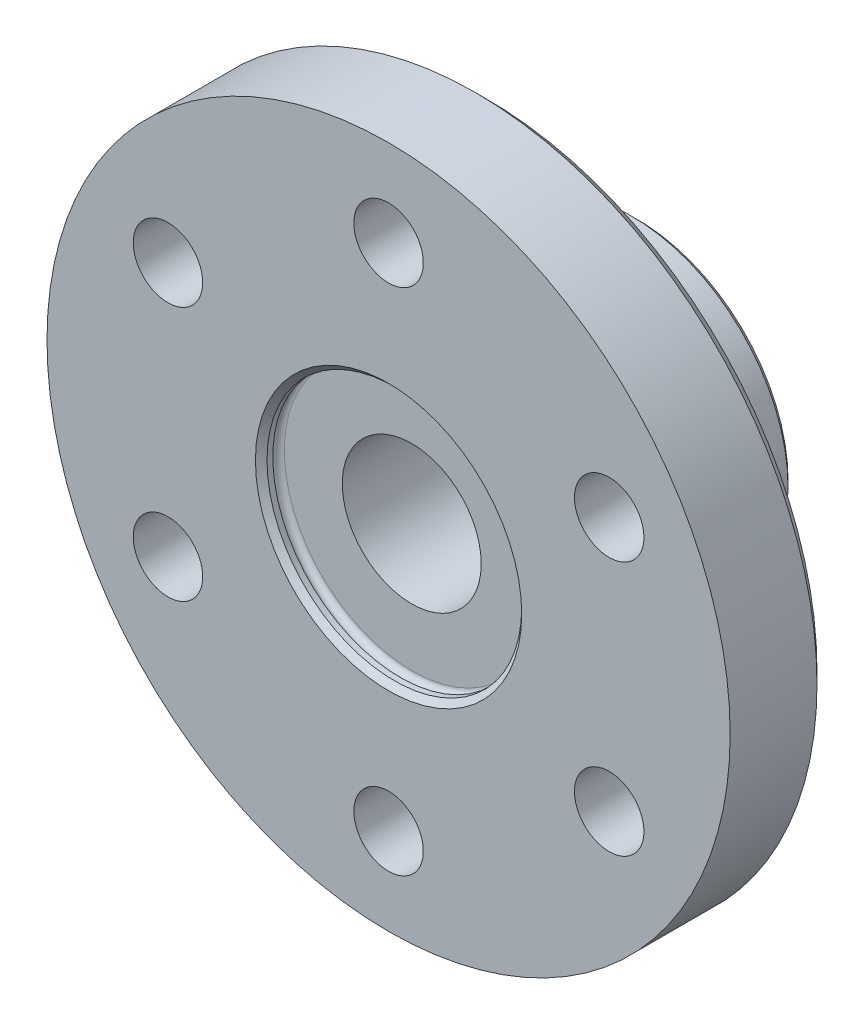
ISO-10303-21;
HEADER;
FILE_DESCRIPTION(('STEP AP214'),'2;1');
FILE_NAME('part.step','',(''),(''),'','','');
FILE_SCHEMA(('AUTOMOTIVE_DESIGN { 1 0 10303 214 1 1 1 1 }'));
ENDSEC;
DATA;
#1=APPLICATION_CONTEXT('core data for automotive mechanical design processes');
#2=APPLICATION_PROTOCOL_DEFINITION('international standard','automotive_design',2000,#1);
#3=PRODUCT_CONTEXT('',#1,'mechanical');
#4=PRODUCT('Part','Part','',(#3));
#5=PRODUCT_RELATED_PRODUCT_CATEGORY('part','',(#4));
#6=PRODUCT_DEFINITION_FORMATION('','',#4);
#7=PRODUCT_DEFINITION_CONTEXT('part definition',#1,'design');
#8=PRODUCT_DEFINITION('design','',#6,#7);
#9=PRODUCT_DEFINITION_SHAPE('','',#8);
#10=(LENGTH_UNIT() NAMED_UNIT(*) SI_UNIT(.MILLI.,.METRE.));
#11=(NAMED_UNIT(*) PLANE_ANGLE_UNIT() SI_UNIT($,.RADIAN.));
#12=(NAMED_UNIT(*) SI_UNIT($,.STERADIAN.) SOLID_ANGLE_UNIT());
#13=UNCERTAINTY_MEASURE_WITH_UNIT(LENGTH_MEASURE(1.E-05),#10,'distance_accuracy_value','');
#14=(GEOMETRIC_REPRESENTATION_CONTEXT(3) GLOBAL_UNCERTAINTY_ASSIGNED_CONTEXT((#13)) GLOBAL_UNIT_ASSIGNED_CONTEXT((#10,
#11,#12)) REPRESENTATION_CONTEXT('',''));
#15=CARTESIAN_POINT('',(0.,0.,0.));
#16=DIRECTION('',(0.,0.,1.));
#17=DIRECTION('',(1.,0.,0.));
#18=AXIS2_PLACEMENT_3D('',#15,#16,#17);
#19=CARTESIAN_POINT('',(0.,0.,-0.376389422192273));
#20=DIRECTION('',(0.,0.,1.));
#21=DIRECTION('',(1.,0.,0.));
#22=AXIS2_PLACEMENT_3D('',#19,#20,#21);
#23=TOROIDAL_SURFACE('',#22,22.,1.);
#24=CARTESIAN_POINT('',(0.,0.,-1.37638942219227));
#25=DIRECTION('',(0.,0.,1.));
#26=DIRECTION('',(1.,0.,0.));
#27=AXIS2_PLACEMENT_3D('',#24,#25,#26);
#28=CIRCLE('',#27,22.);
#29=CARTESIAN_POINT('',(22.,0.,-1.37638942219227));
#30=VERTEX_POINT('',#29);
#31=EDGE_CURVE('E78',#30,#30,#28,.T.);
#32=ORIENTED_EDGE('',*,*,#31,.F.);
#33=EDGE_LOOP('',(#32));
#34=FACE_BOUND('',#33,.T.);
#35=CARTESIAN_POINT('',(0.,0.,0.623610577807727));
#36=DIRECTION('',(0.,0.,1.));
#37=DIRECTION('',(1.,0.,0.));
#38=AXIS2_PLACEMENT_3D('',#35,#36,#37);
#39=CIRCLE('',#38,22.);
#40=CARTESIAN_POINT('',(22.,0.,0.623610577807727));
#41=VERTEX_POINT('',#40);
#42=EDGE_CURVE('E87',#41,#41,#39,.T.);
#43=ORIENTED_EDGE('',*,*,#42,.T.);
#44=EDGE_LOOP('',(#43));
#45=FACE_BOUND('',#44,.T.);
#46=ADVANCED_FACE('F39',(#34,#45),#23,.F.);
#47=CARTESIAN_POINT('',(0.,12.,-1.37638942219227));
#48=DIRECTION('',(0.,0.,-1.));
#49=DIRECTION('',(-1.,0.,0.));
#50=AXIS2_PLACEMENT_3D('',#47,#48,#49);
#51=PLANE('',#50);
#52=CARTESIAN_POINT('',(0.,0.,-1.37638942219227));
#53=DIRECTION('',(0.,0.,1.));
#54=DIRECTION('',(1.,0.,0.));
#55=AXIS2_PLACEMENT_3D('',#52,#53,#54);
#56=CIRCLE('',#55,12.);
#57=CARTESIAN_POINT('',(12.,0.,-1.37638942219227));
#58=VERTEX_POINT('',#57);
#59=EDGE_CURVE('E81',#58,#58,#56,.T.);
#60=ORIENTED_EDGE('',*,*,#59,.F.);
#61=EDGE_LOOP('',(#60));
#62=FACE_BOUND('',#61,.T.);
#63=ORIENTED_EDGE('',*,*,#31,.T.);
#64=EDGE_LOOP('',(#63));
#65=FACE_BOUND('',#64,.T.);
#66=ADVANCED_FACE('F160',(#62,#65),#51,.F.);
#67=CARTESIAN_POINT('',(0.,0.,9.0012233726392));
#68=DIRECTION('',(0.,0.,1.));
#69=DIRECTION('',(1.,0.,0.));
#70=AXIS2_PLACEMENT_3D('',#67,#68,#69);
#71=CYLINDRICAL_SURFACE('',#70,12.);
#72=CARTESIAN_POINT('',(0.,0.,-39.3763894221923));
#73=DIRECTION('',(0.,0.,1.));
#74=DIRECTION('',(1.,0.,0.));
#75=AXIS2_PLACEMENT_3D('',#72,#73,#74);
#76=CIRCLE('',#75,12.);
#77=CARTESIAN_POINT('',(12.,0.,-39.3763894221923));
#78=VERTEX_POINT('',#77);
#79=EDGE_CURVE('E55',#78,#78,#76,.F.);
#80=ORIENTED_EDGE('',*,*,#79,.T.);
#81=EDGE_LOOP('',(#80));
#82=FACE_BOUND('',#81,.T.);
#83=ORIENTED_EDGE('',*,*,#59,.T.);
#84=EDGE_LOOP('',(#83));
#85=FACE_BOUND('',#84,.T.);
#86=ADVANCED_FACE('F166',(#82,#85),#71,.F.);
#87=CARTESIAN_POINT('',(0.,27.,-40.3763894221923));
#88=DIRECTION('',(0.,0.,1.));
#89=DIRECTION('',(1.,0.,0.));
#90=AXIS2_PLACEMENT_3D('',#87,#88,#89);
#91=PLANE('',#90);
#92=CARTESIAN_POINT('',(0.,0.,-40.3763894221923));
#93=DIRECTION('',(0.,0.,1.));
#94=DIRECTION('',(1.,0.,0.));
#95=AXIS2_PLACEMENT_3D('',#92,#93,#94);
#96=CIRCLE('',#95,13.);
#97=CARTESIAN_POINT('',(13.,0.,-40.3763894221923));
#98=VERTEX_POINT('',#97);
#99=EDGE_CURVE('E60',#98,#98,#96,.T.);
#100=ORIENTED_EDGE('',*,*,#99,.T.);
#101=EDGE_LOOP('',(#100));
#102=FACE_BOUND('',#101,.T.);
#103=CARTESIAN_POINT('',(0.,0.,-40.3763894221923));
#104=DIRECTION('',(0.,0.,1.));
#105=DIRECTION('',(1.,0.,0.));
#106=AXIS2_PLACEMENT_3D('',#103,#104,#105);
#107=CIRCLE('',#106,26.);
#108=CARTESIAN_POINT('',(26.,0.,-40.3763894221923));
#109=VERTEX_POINT('',#108);
#110=EDGE_CURVE('E63',#109,#109,#107,.F.);
#111=ORIENTED_EDGE('',*,*,#110,.T.);
#112=EDGE_LOOP('',(#111));
#113=FACE_BOUND('',#112,.T.);
#114=ADVANCED_FACE('F207',(#102,#113),#91,.F.);
#115=CARTESIAN_POINT('',(0.,0.,9.0012233726392));
#116=DIRECTION('',(0.,0.,1.));
#117=DIRECTION('',(1.,0.,0.));
#118=AXIS2_PLACEMENT_3D('',#115,#116,#117);
#119=CYLINDRICAL_SURFACE('',#118,27.);
#120=CARTESIAN_POINT('',(0.,0.,-39.3763894221923));
#121=DIRECTION('',(0.,0.,1.));
#122=DIRECTION('',(1.,0.,0.));
#123=AXIS2_PLACEMENT_3D('',#120,#121,#122);
#124=CIRCLE('',#123,27.);
#125=CARTESIAN_POINT('',(27.,0.,-39.3763894221923));
#126=VERTEX_POINT('',#125);
#127=EDGE_CURVE('E51',#126,#126,#124,.T.);
#128=ORIENTED_EDGE('',*,*,#127,.T.);
#129=EDGE_LOOP('',(#128));
#130=FACE_BOUND('',#129,.T.);
#131=CARTESIAN_POINT('',(0.,0.,-16.3763894221923));
#132=DIRECTION('',(0.,0.,1.));
#133=DIRECTION('',(1.,0.,0.));
#134=AXIS2_PLACEMENT_3D('',#131,#132,#133);
#135=CIRCLE('',#134,27.);
#136=CARTESIAN_POINT('',(27.,0.,-16.3763894221923));
#137=VERTEX_POINT('',#136);
#138=EDGE_CURVE('E72',#137,#137,#135,.F.);
#139=ORIENTED_EDGE('',*,*,#138,.T.);
#140=EDGE_LOOP('',(#139));
#141=FACE_BOUND('',#140,.T.);
#142=ADVANCED_FACE('F134',(#130,#141),#119,.T.);
#143=CARTESIAN_POINT('',(0.,59.,-14.3763894221923));
#144=DIRECTION('',(0.,0.,1.));
#145=DIRECTION('',(1.,0.,0.));
#146=AXIS2_PLACEMENT_3D('',#143,#144,#145);
#147=PLANE('',#146);
#148=CARTESIAN_POINT('',(0.,0.,-14.3763894221923));
#149=DIRECTION('',(0.,0.,1.));
#150=DIRECTION('',(1.,0.,0.));
#151=AXIS2_PLACEMENT_3D('',#148,#149,#150);
#152=CIRCLE('',#151,57.);
#153=CARTESIAN_POINT('',(57.,0.,-14.3763894221923));
#154=VERTEX_POINT('',#153);
#155=EDGE_CURVE('E10',#154,#154,#152,.F.);
#156=ORIENTED_EDGE('',*,*,#155,.T.);
#157=EDGE_LOOP('',(#156));
#158=FACE_BOUND('',#157,.T.);
#159=CARTESIAN_POINT('',(0.,0.,-14.3763894221923));
#160=DIRECTION('',(0.,0.,1.));
#161=DIRECTION('',(1.,0.,0.));
#162=AXIS2_PLACEMENT_3D('',#159,#160,#161);
#163=CIRCLE('',#162,29.);
#164=CARTESIAN_POINT('',(29.,0.,-14.3763894221923));
#165=VERTEX_POINT('',#164);
#166=EDGE_CURVE('E75',#165,#165,#163,.T.);
#167=ORIENTED_EDGE('',*,*,#166,.T.);
#168=EDGE_LOOP('',(#167));
#169=FACE_BOUND('',#168,.T.);
#170=CARTESIAN_POINT('',(38.105117766515,22.0000000000004,-14.3763894221923));
#171=DIRECTION('',(0.,0.,-1.));
#172=DIRECTION('',(-0.50000000000001,0.866025403784433,0.));
#173=AXIS2_PLACEMENT_3D('',#170,#171,#172);
#174=CIRCLE('',#173,6.);
#175=CARTESIAN_POINT('',(35.105117766515,27.196152422707,-14.3763894221923));
#176=VERTEX_POINT('',#175);
#177=EDGE_CURVE('E107',#176,#176,#174,.T.);
#178=ORIENTED_EDGE('',*,*,#177,.F.);
#179=EDGE_LOOP('',(#178));
#180=FACE_BOUND('',#179,.T.);
#181=CARTESIAN_POINT('',(38.1051177665155,-21.9999999999996,-14.3763894221923));
#182=DIRECTION('',(0.,0.,-1.));
#183=DIRECTION('',(0.499999999999992,0.866025403784443,0.));
#184=AXIS2_PLACEMENT_3D('',#181,#182,#183);
#185=CIRCLE('',#184,6.);
#186=CARTESIAN_POINT('',(41.1051177665154,-16.803847577293,-14.3763894221923));
#187=VERTEX_POINT('',#186);
#188=EDGE_CURVE('E106',#187,#187,#185,.T.);
#189=ORIENTED_EDGE('',*,*,#188,.F.);
#190=EDGE_LOOP('',(#189));
#191=FACE_BOUND('',#190,.T.);
#192=CARTESIAN_POINT('',(0.,-44.,-14.3763894221923));
#193=DIRECTION('',(0.,0.,-1.));
#194=DIRECTION('',(1.,0.,0.));
#195=AXIS2_PLACEMENT_3D('',#192,#193,#194);
#196=CIRCLE('',#195,6.);
#197=CARTESIAN_POINT('',(6.,-44.,-14.3763894221923));
#198=VERTEX_POINT('',#197);
#199=EDGE_CURVE('E113',#198,#198,#196,.T.);
#200=ORIENTED_EDGE('',*,*,#199,.F.);
#201=EDGE_LOOP('',(#200));
#202=FACE_BOUND('',#201,.T.);
#203=CARTESIAN_POINT('',(-38.1051177665152,-22.0000000000002,-14.3763894221923));
#204=DIRECTION('',(0.,0.,-1.));
#205=DIRECTION('',(0.500000000000004,-0.866025403784436,0.));
#206=AXIS2_PLACEMENT_3D('',#203,#204,#205);
#207=CIRCLE('',#206,6.);
#208=CARTESIAN_POINT('',(-35.1051177665152,-27.1961524227068,-14.3763894221923));
#209=VERTEX_POINT('',#208);
#210=EDGE_CURVE('E119',#209,#209,#207,.T.);
#211=ORIENTED_EDGE('',*,*,#210,.F.);
#212=EDGE_LOOP('',(#211));
#213=FACE_BOUND('',#212,.T.);
#214=CARTESIAN_POINT('',(-38.1051177665153,21.9999999999999,-14.3763894221923));
#215=DIRECTION('',(0.,0.,-1.));
#216=DIRECTION('',(-0.499999999999998,-0.86602540378444,0.));
#217=AXIS2_PLACEMENT_3D('',#214,#215,#216);
#218=CIRCLE('',#217,6.);
#219=CARTESIAN_POINT('',(-41.1051177665153,16.8038475772933,-14.3763894221923));
#220=VERTEX_POINT('',#219);
#221=EDGE_CURVE('E99',#220,#220,#218,.T.);
#222=ORIENTED_EDGE('',*,*,#221,.F.);
#223=EDGE_LOOP('',(#222));
#224=FACE_BOUND('',#223,.T.);
#225=CARTESIAN_POINT('',(0.,44.,-14.3763894221923));
#226=DIRECTION('',(0.,0.,-1.));
#227=DIRECTION('',(-1.,0.,0.));
#228=AXIS2_PLACEMENT_3D('',#225,#226,#227);
#229=CIRCLE('',#228,6.);
#230=CARTESIAN_POINT('',(-6.,44.,-14.3763894221923));
#231=VERTEX_POINT('',#230);
#232=EDGE_CURVE('E93',#231,#231,#229,.T.);
#233=ORIENTED_EDGE('',*,*,#232,.F.);
#234=EDGE_LOOP('',(#233));
#235=FACE_BOUND('',#234,.T.);
#236=ADVANCED_FACE('F130',(#158,#169,#180,#191,#202,#213,#224,#235),#147,.F.);
#237=CARTESIAN_POINT('',(0.,0.,9.0012233726392));
#238=DIRECTION('',(0.,0.,1.));
#239=DIRECTION('',(1.,0.,0.));
#240=AXIS2_PLACEMENT_3D('',#237,#238,#239);
#241=CYLINDRICAL_SURFACE('',#240,59.);
#242=CARTESIAN_POINT('',(0.,0.,-12.3763894221923));
#243=DIRECTION('',(0.,0.,1.));
#244=DIRECTION('',(1.,0.,0.));
#245=AXIS2_PLACEMENT_3D('',#242,#243,#244);
#246=CIRCLE('',#245,59.);
#247=CARTESIAN_POINT('',(59.,0.,-12.3763894221923));
#248=VERTEX_POINT('',#247);
#249=EDGE_CURVE('E47',#248,#248,#246,.T.);
#250=ORIENTED_EDGE('',*,*,#249,.T.);
#251=EDGE_LOOP('',(#250));
#252=FACE_BOUND('',#251,.T.);
#253=CARTESIAN_POINT('',(0.,0.,2.62361057780773));
#254=DIRECTION('',(0.,0.,1.));
#255=DIRECTION('',(1.,0.,0.));
#256=AXIS2_PLACEMENT_3D('',#253,#254,#255);
#257=CIRCLE('',#256,59.);
#258=CARTESIAN_POINT('',(59.,0.,2.62361057780773));
#259=VERTEX_POINT('',#258);
#260=EDGE_CURVE('E84',#259,#259,#257,.T.);
#261=ORIENTED_EDGE('',*,*,#260,.F.);
#262=EDGE_LOOP('',(#261));
#263=FACE_BOUND('',#262,.T.);
#264=ADVANCED_FACE('F133',(#252,#263),#241,.T.);
#265=CARTESIAN_POINT('',(0.,22.,2.62361057780773));
#266=DIRECTION('',(0.,0.,-1.));
#267=DIRECTION('',(-1.,0.,0.));
#268=AXIS2_PLACEMENT_3D('',#265,#266,#267);
#269=PLANE('',#268);
#270=CARTESIAN_POINT('',(0.,0.,2.62361057780773));
#271=DIRECTION('',(0.,0.,-1.));
#272=DIRECTION('',(-1.,0.,0.));
#273=AXIS2_PLACEMENT_3D('',#270,#271,#272);
#274=CIRCLE('',#273,23.);
#275=CARTESIAN_POINT('',(-23.,0.,2.62361057780773));
#276=VERTEX_POINT('',#275);
#277=EDGE_CURVE('E66',#276,#276,#274,.T.);
#278=ORIENTED_EDGE('',*,*,#277,.T.);
#279=EDGE_LOOP('',(#278));
#280=FACE_BOUND('',#279,.T.);
#281=CARTESIAN_POINT('',(38.105117766515,22.0000000000004,2.62361057780773));
#282=DIRECTION('',(0.,0.,-1.));
#283=DIRECTION('',(-1.,0.,0.));
#284=AXIS2_PLACEMENT_3D('',#281,#282,#283);
#285=CIRCLE('',#284,6.);
#286=CARTESIAN_POINT('',(32.105117766515,22.0000000000004,2.62361057780773));
#287=VERTEX_POINT('',#286);
#288=EDGE_CURVE('E103',#287,#287,#285,.F.);
#289=ORIENTED_EDGE('',*,*,#288,.F.);
#290=EDGE_LOOP('',(#289));
#291=FACE_BOUND('',#290,.T.);
#292=CARTESIAN_POINT('',(38.1051177665155,-21.9999999999996,2.62361057780773));
#293=DIRECTION('',(0.,0.,-1.));
#294=DIRECTION('',(-1.,0.,0.));
#295=AXIS2_PLACEMENT_3D('',#292,#293,#294);
#296=CIRCLE('',#295,6.);
#297=CARTESIAN_POINT('',(32.1051177665155,-21.9999999999996,2.62361057780773));
#298=VERTEX_POINT('',#297);
#299=EDGE_CURVE('E110',#298,#298,#296,.F.);
#300=ORIENTED_EDGE('',*,*,#299,.F.);
#301=EDGE_LOOP('',(#300));
#302=FACE_BOUND('',#301,.T.);
#303=CARTESIAN_POINT('',(0.,-44.,2.62361057780773));
#304=DIRECTION('',(0.,0.,-1.));
#305=DIRECTION('',(-1.,0.,0.));
#306=AXIS2_PLACEMENT_3D('',#303,#304,#305);
#307=CIRCLE('',#306,6.);
#308=CARTESIAN_POINT('',(-6.,-44.,2.62361057780773));
#309=VERTEX_POINT('',#308);
#310=EDGE_CURVE('E116',#309,#309,#307,.F.);
#311=ORIENTED_EDGE('',*,*,#310,.F.);
#312=EDGE_LOOP('',(#311));
#313=FACE_BOUND('',#312,.T.);
#314=CARTESIAN_POINT('',(-38.1051177665152,-22.0000000000002,2.62361057780773));
#315=DIRECTION('',(0.,0.,-1.));
#316=DIRECTION('',(-1.,0.,0.));
#317=AXIS2_PLACEMENT_3D('',#314,#315,#316);
#318=CIRCLE('',#317,6.);
#319=CARTESIAN_POINT('',(-44.1051177665152,-22.0000000000002,2.62361057780773));
#320=VERTEX_POINT('',#319);
#321=EDGE_CURVE('E102',#320,#320,#318,.F.);
#322=ORIENTED_EDGE('',*,*,#321,.F.);
#323=EDGE_LOOP('',(#322));
#324=FACE_BOUND('',#323,.T.);
#325=CARTESIAN_POINT('',(-38.1051177665153,21.9999999999999,2.62361057780773));
#326=DIRECTION('',(0.,0.,-1.));
#327=DIRECTION('',(-1.,0.,0.));
#328=AXIS2_PLACEMENT_3D('',#325,#326,#327);
#329=CIRCLE('',#328,6.);
#330=CARTESIAN_POINT('',(-44.1051177665153,21.9999999999999,2.62361057780773));
#331=VERTEX_POINT('',#330);
#332=EDGE_CURVE('E96',#331,#331,#329,.F.);
#333=ORIENTED_EDGE('',*,*,#332,.F.);
#334=EDGE_LOOP('',(#333));
#335=FACE_BOUND('',#334,.T.);
#336=CARTESIAN_POINT('',(0.,44.,2.62361057780773));
#337=DIRECTION('',(0.,0.,-1.));
#338=DIRECTION('',(-1.,0.,0.));
#339=AXIS2_PLACEMENT_3D('',#336,#337,#338);
#340=CIRCLE('',#339,6.);
#341=CARTESIAN_POINT('',(-6.,44.,2.62361057780773));
#342=VERTEX_POINT('',#341);
#343=EDGE_CURVE('E90',#342,#342,#340,.F.);
#344=ORIENTED_EDGE('',*,*,#343,.F.);
#345=EDGE_LOOP('',(#344));
#346=FACE_BOUND('',#345,.T.);
#347=ORIENTED_EDGE('',*,*,#260,.T.);
#348=EDGE_LOOP('',(#347));
#349=FACE_BOUND('',#348,.T.);
#350=ADVANCED_FACE('F148',(#280,#291,#302,#313,#324,#335,#346,#349),#269,.F.);
#351=CARTESIAN_POINT('',(0.,0.,9.0012233726392));
#352=DIRECTION('',(0.,0.,1.));
#353=DIRECTION('',(1.,0.,0.));
#354=AXIS2_PLACEMENT_3D('',#351,#352,#353);
#355=CYLINDRICAL_SURFACE('',#354,22.);
#356=CARTESIAN_POINT('',(0.,0.,1.62361057780775));
#357=DIRECTION('',(0.,0.,-1.));
#358=DIRECTION('',(-1.,0.,0.));
#359=AXIS2_PLACEMENT_3D('',#356,#357,#358);
#360=CIRCLE('',#359,22.);
#361=CARTESIAN_POINT('',(-22.,0.,1.62361057780775));
#362=VERTEX_POINT('',#361);
#363=EDGE_CURVE('E69',#362,#362,#360,.F.);
#364=ORIENTED_EDGE('',*,*,#363,.T.);
#365=EDGE_LOOP('',(#364));
#366=FACE_BOUND('',#365,.T.);
#367=ORIENTED_EDGE('',*,*,#42,.F.);
#368=EDGE_LOOP('',(#367));
#369=FACE_BOUND('',#368,.T.);
#370=ADVANCED_FACE('F144',(#366,#369),#355,.F.);
#371=CARTESIAN_POINT('',(0.,44.,2.62461057780773));
#372=DIRECTION('',(0.,0.,-1.));
#373=DIRECTION('',(-1.,0.,0.));
#374=AXIS2_PLACEMENT_3D('',#371,#372,#373);
#375=CYLINDRICAL_SURFACE('',#374,6.);
#376=ORIENTED_EDGE('',*,*,#232,.T.);
#377=EDGE_LOOP('',(#376));
#378=FACE_BOUND('',#377,.T.);
#379=ORIENTED_EDGE('',*,*,#343,.T.);
#380=EDGE_LOOP('',(#379));
#381=FACE_BOUND('',#380,.T.);
#382=ADVANCED_FACE('F140',(#378,#381),#375,.F.);
#383=CARTESIAN_POINT('',(-38.1051177665153,21.9999999999999,2.62461057780773));
#384=DIRECTION('',(0.,0.,-1.));
#385=DIRECTION('',(-1.,0.,0.));
#386=AXIS2_PLACEMENT_3D('',#383,#384,#385);
#387=CYLINDRICAL_SURFACE('',#386,6.);
#388=ORIENTED_EDGE('',*,*,#221,.T.);
#389=EDGE_LOOP('',(#388));
#390=FACE_BOUND('',#389,.T.);
#391=ORIENTED_EDGE('',*,*,#332,.T.);
#392=EDGE_LOOP('',(#391));
#393=FACE_BOUND('',#392,.T.);
#394=ADVANCED_FACE('F143',(#390,#393),#387,.F.);
#395=CARTESIAN_POINT('',(-38.1051177665152,-22.0000000000002,2.62461057780773));
#396=DIRECTION('',(0.,0.,-1.));
#397=DIRECTION('',(-1.,0.,0.));
#398=AXIS2_PLACEMENT_3D('',#395,#396,#397);
#399=CYLINDRICAL_SURFACE('',#398,6.);
#400=ORIENTED_EDGE('',*,*,#210,.T.);
#401=EDGE_LOOP('',(#400));
#402=FACE_BOUND('',#401,.T.);
#403=ORIENTED_EDGE('',*,*,#321,.T.);
#404=EDGE_LOOP('',(#403));
#405=FACE_BOUND('',#404,.T.);
#406=ADVANCED_FACE('F127',(#402,#405),#399,.F.);
#407=CARTESIAN_POINT('',(0.,-44.,2.62461057780773));
#408=DIRECTION('',(0.,0.,-1.));
#409=DIRECTION('',(-1.,0.,0.));
#410=AXIS2_PLACEMENT_3D('',#407,#408,#409);
#411=CYLINDRICAL_SURFACE('',#410,6.);
#412=ORIENTED_EDGE('',*,*,#199,.T.);
#413=EDGE_LOOP('',(#412));
#414=FACE_BOUND('',#413,.T.);
#415=ORIENTED_EDGE('',*,*,#310,.T.);
#416=EDGE_LOOP('',(#415));
#417=FACE_BOUND('',#416,.T.);
#418=ADVANCED_FACE('F220',(#414,#417),#411,.F.);
#419=CARTESIAN_POINT('',(38.1051177665155,-21.9999999999996,2.62461057780773));
#420=DIRECTION('',(0.,0.,-1.));
#421=DIRECTION('',(-1.,0.,0.));
#422=AXIS2_PLACEMENT_3D('',#419,#420,#421);
#423=CYLINDRICAL_SURFACE('',#422,6.);
#424=ORIENTED_EDGE('',*,*,#188,.T.);
#425=EDGE_LOOP('',(#424));
#426=FACE_BOUND('',#425,.T.);
#427=ORIENTED_EDGE('',*,*,#299,.T.);
#428=EDGE_LOOP('',(#427));
#429=FACE_BOUND('',#428,.T.);
#430=ADVANCED_FACE('F223',(#426,#429),#423,.F.);
#431=CARTESIAN_POINT('',(38.105117766515,22.0000000000004,2.62461057780773));
#432=DIRECTION('',(0.,0.,-1.));
#433=DIRECTION('',(-1.,0.,0.));
#434=AXIS2_PLACEMENT_3D('',#431,#432,#433);
#435=CYLINDRICAL_SURFACE('',#434,6.);
#436=ORIENTED_EDGE('',*,*,#177,.T.);
#437=EDGE_LOOP('',(#436));
#438=FACE_BOUND('',#437,.T.);
#439=ORIENTED_EDGE('',*,*,#288,.T.);
#440=EDGE_LOOP('',(#439));
#441=FACE_BOUND('',#440,.T.);
#442=ADVANCED_FACE('F177',(#438,#441),#435,.F.);
#443=CARTESIAN_POINT('',(0.,0.,-16.3763894221923));
#444=DIRECTION('',(0.,0.,1.));
#445=DIRECTION('',(1.,0.,0.));
#446=AXIS2_PLACEMENT_3D('',#443,#444,#445);
#447=TOROIDAL_SURFACE('',#446,29.,2.);
#448=ORIENTED_EDGE('',*,*,#138,.F.);
#449=EDGE_LOOP('',(#448));
#450=FACE_BOUND('',#449,.T.);
#451=ORIENTED_EDGE('',*,*,#166,.F.);
#452=EDGE_LOOP('',(#451));
#453=FACE_BOUND('',#452,.T.);
#454=ADVANCED_FACE('F173',(#450,#453),#447,.F.);
#455=CARTESIAN_POINT('',(0.,0.,1.62361057780775));
#456=DIRECTION('',(0.,0.,1.));
#457=DIRECTION('',(1.,0.,0.));
#458=AXIS2_PLACEMENT_3D('',#455,#456,#457);
#459=CONICAL_SURFACE('',#458,22.,0.785398163397445);
#460=ORIENTED_EDGE('',*,*,#277,.F.);
#461=EDGE_LOOP('',(#460));
#462=FACE_BOUND('',#461,.T.);
#463=ORIENTED_EDGE('',*,*,#363,.F.);
#464=EDGE_LOOP('',(#463));
#465=FACE_BOUND('',#464,.T.);
#466=ADVANCED_FACE('F176',(#462,#465),#459,.F.);
#467=CARTESIAN_POINT('',(0.,0.,-40.3763894221923));
#468=DIRECTION('',(0.,0.,-1.));
#469=DIRECTION('',(-1.,0.,0.));
#470=AXIS2_PLACEMENT_3D('',#467,#468,#469);
#471=CONICAL_SURFACE('',#470,13.,0.785398163397449);
#472=ORIENTED_EDGE('',*,*,#79,.F.);
#473=EDGE_LOOP('',(#472));
#474=FACE_BOUND('',#473,.T.);
#475=ORIENTED_EDGE('',*,*,#99,.F.);
#476=EDGE_LOOP('',(#475));
#477=FACE_BOUND('',#476,.T.);
#478=ADVANCED_FACE('F185',(#474,#477),#471,.F.);
#479=CARTESIAN_POINT('',(0.,0.,-39.3763894221923));
#480=DIRECTION('',(0.,0.,1.));
#481=DIRECTION('',(1.,0.,0.));
#482=AXIS2_PLACEMENT_3D('',#479,#480,#481);
#483=CONICAL_SURFACE('',#482,27.,0.785398163397455);
#484=ORIENTED_EDGE('',*,*,#110,.F.);
#485=EDGE_LOOP('',(#484));
#486=FACE_BOUND('',#485,.T.);
#487=ORIENTED_EDGE('',*,*,#127,.F.);
#488=EDGE_LOOP('',(#487));
#489=FACE_BOUND('',#488,.T.);
#490=ADVANCED_FACE('F191',(#486,#489),#483,.T.);
#491=CARTESIAN_POINT('',(0.,0.,-12.3763894221923));
#492=DIRECTION('',(0.,0.,1.));
#493=DIRECTION('',(1.,0.,0.));
#494=AXIS2_PLACEMENT_3D('',#491,#492,#493);
#495=CONICAL_SURFACE('',#494,59.,0.785398163397452);
#496=ORIENTED_EDGE('',*,*,#155,.F.);
#497=EDGE_LOOP('',(#496));
#498=FACE_BOUND('',#497,.T.);
#499=ORIENTED_EDGE('',*,*,#249,.F.);
#500=EDGE_LOOP('',(#499));
#501=FACE_BOUND('',#500,.T.);
#502=ADVANCED_FACE('F42',(#498,#501),#495,.T.);
#503=CLOSED_SHELL('',(#46,#66,#86,#114,#142,#236,#264,#350,#370,#382,#394,#406,#418,#430,#442,
#454,#466,#478,#490,#502));
#504=MANIFOLD_SOLID_BREP('B2',#503);
#505=ADVANCED_BREP_SHAPE_REPRESENTATION('',(#18,#504),#14);
#506=SHAPE_DEFINITION_REPRESENTATION(#9,#505);
ENDSEC;
END-ISO-10303-21;
